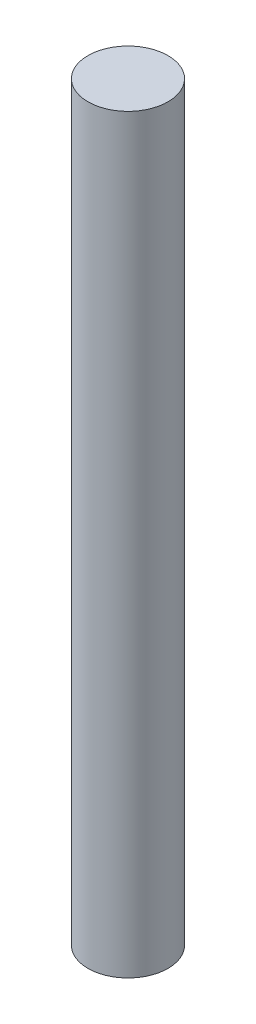
ISO-10303-21;
HEADER;
FILE_DESCRIPTION(('STEP AP214'),'2;1');
FILE_NAME('part.step','',(''),(''),'','','');
FILE_SCHEMA(('AUTOMOTIVE_DESIGN { 1 0 10303 214 1 1 1 1 }'));
ENDSEC;
DATA;
#1=APPLICATION_CONTEXT('core data for automotive mechanical design processes');
#2=APPLICATION_PROTOCOL_DEFINITION('international standard','automotive_design',2000,#1);
#3=PRODUCT_CONTEXT('',#1,'mechanical');
#4=PRODUCT('Part','Part','',(#3));
#5=PRODUCT_RELATED_PRODUCT_CATEGORY('part','',(#4));
#6=PRODUCT_DEFINITION_FORMATION('','',#4);
#7=PRODUCT_DEFINITION_CONTEXT('part definition',#1,'design');
#8=PRODUCT_DEFINITION('design','',#6,#7);
#9=PRODUCT_DEFINITION_SHAPE('','',#8);
#10=(LENGTH_UNIT() NAMED_UNIT(*) SI_UNIT(.MILLI.,.METRE.));
#11=(NAMED_UNIT(*) PLANE_ANGLE_UNIT() SI_UNIT($,.RADIAN.));
#12=(NAMED_UNIT(*) SI_UNIT($,.STERADIAN.) SOLID_ANGLE_UNIT());
#13=UNCERTAINTY_MEASURE_WITH_UNIT(LENGTH_MEASURE(1.E-05),#10,'distance_accuracy_value','');
#14=(GEOMETRIC_REPRESENTATION_CONTEXT(3) GLOBAL_UNCERTAINTY_ASSIGNED_CONTEXT((#13)) GLOBAL_UNIT_ASSIGNED_CONTEXT((#10,
#11,#12)) REPRESENTATION_CONTEXT('',''));
#15=CARTESIAN_POINT('',(0.,0.,0.));
#16=DIRECTION('',(0.,0.,1.));
#17=DIRECTION('',(1.,0.,0.));
#18=AXIS2_PLACEMENT_3D('',#15,#16,#17);
#19=CARTESIAN_POINT('',(0.,75.,0.));
#20=DIRECTION('',(0.,-1.,0.));
#21=DIRECTION('',(0.,0.,-1.));
#22=AXIS2_PLACEMENT_3D('',#19,#20,#21);
#23=CYLINDRICAL_SURFACE('',#22,8.);
#24=CARTESIAN_POINT('',(0.,75.,0.));
#25=DIRECTION('',(0.,1.,0.));
#26=DIRECTION('',(0.,0.,1.));
#27=AXIS2_PLACEMENT_3D('',#24,#25,#26);
#28=CIRCLE('',#27,8.);
#29=CARTESIAN_POINT('',(0.,75.,8.));
#30=VERTEX_POINT('',#29);
#31=EDGE_CURVE('E12',#30,#30,#28,.T.);
#32=ORIENTED_EDGE('',*,*,#31,.F.);
#33=EDGE_LOOP('',(#32));
#34=FACE_BOUND('',#33,.T.);
#35=CARTESIAN_POINT('',(0.,-75.,0.));
#36=DIRECTION('',(0.,1.,0.));
#37=DIRECTION('',(0.,0.,1.));
#38=AXIS2_PLACEMENT_3D('',#35,#36,#37);
#39=CIRCLE('',#38,8.);
#40=CARTESIAN_POINT('',(0.,-75.,8.));
#41=VERTEX_POINT('',#40);
#42=EDGE_CURVE('E49',#41,#41,#39,.T.);
#43=ORIENTED_EDGE('',*,*,#42,.T.);
#44=EDGE_LOOP('',(#43));
#45=FACE_BOUND('',#44,.T.);
#46=ADVANCED_FACE('F46',(#34,#45),#23,.T.);
#47=CARTESIAN_POINT('',(0.,75.,0.));
#48=DIRECTION('',(0.,1.,0.));
#49=DIRECTION('',(0.,0.,1.));
#50=AXIS2_PLACEMENT_3D('',#47,#48,#49);
#51=PLANE('',#50);
#52=ORIENTED_EDGE('',*,*,#31,.T.);
#53=EDGE_LOOP('',(#52));
#54=FACE_BOUND('',#53,.T.);
#55=ADVANCED_FACE('F61',(#54),#51,.T.);
#56=CARTESIAN_POINT('',(0.,-75.,0.));
#57=DIRECTION('',(0.,1.,0.));
#58=DIRECTION('',(0.,0.,1.));
#59=AXIS2_PLACEMENT_3D('',#56,#57,#58);
#60=PLANE('',#59);
#61=ORIENTED_EDGE('',*,*,#42,.F.);
#62=EDGE_LOOP('',(#61));
#63=FACE_BOUND('',#62,.T.);
#64=ADVANCED_FACE('F59',(#63),#60,.F.);
#65=CLOSED_SHELL('',(#46,#55,#64));
#66=MANIFOLD_SOLID_BREP('B2',#65);
#67=ADVANCED_BREP_SHAPE_REPRESENTATION('',(#18,#66),#14);
#68=SHAPE_DEFINITION_REPRESENTATION(#9,#67);
ENDSEC;
END-ISO-10303-21;
